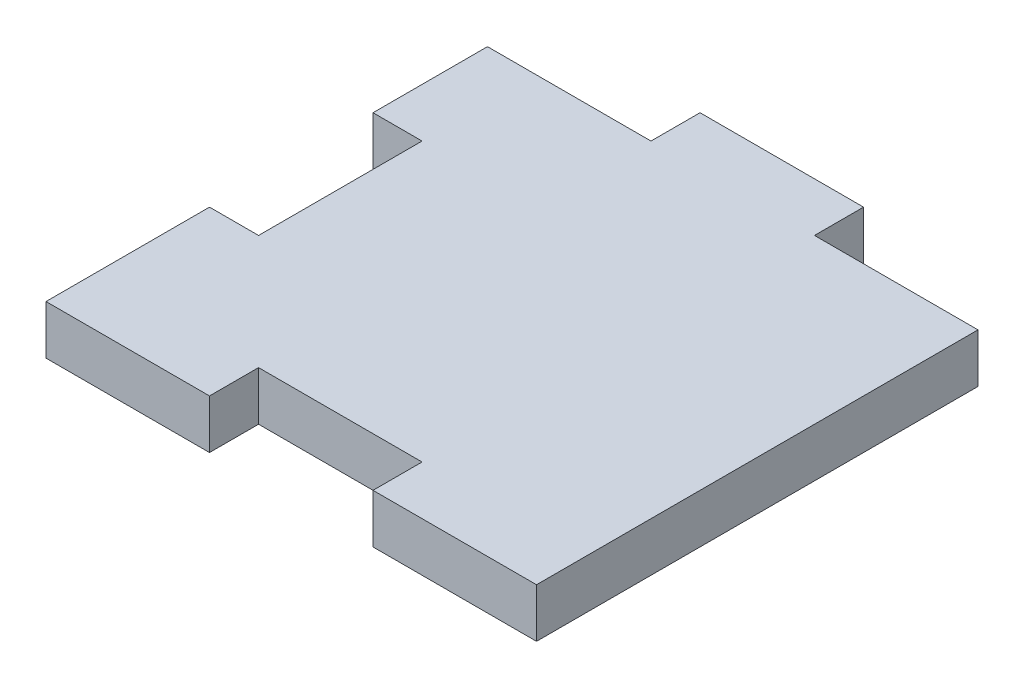
ISO-10303-21;
HEADER;
FILE_DESCRIPTION(('STEP AP214'),'2;1');
FILE_NAME('part.step','',(''),(''),'','','');
FILE_SCHEMA(('AUTOMOTIVE_DESIGN { 1 0 10303 214 1 1 1 1 }'));
ENDSEC;
DATA;
#1=APPLICATION_CONTEXT('core data for automotive mechanical design processes');
#2=APPLICATION_PROTOCOL_DEFINITION('international standard','automotive_design',2000,#1);
#3=PRODUCT_CONTEXT('',#1,'mechanical');
#4=PRODUCT('Part','Part','',(#3));
#5=PRODUCT_RELATED_PRODUCT_CATEGORY('part','',(#4));
#6=PRODUCT_DEFINITION_FORMATION('','',#4);
#7=PRODUCT_DEFINITION_CONTEXT('part definition',#1,'design');
#8=PRODUCT_DEFINITION('design','',#6,#7);
#9=PRODUCT_DEFINITION_SHAPE('','',#8);
#10=(LENGTH_UNIT() NAMED_UNIT(*) SI_UNIT(.MILLI.,.METRE.));
#11=(NAMED_UNIT(*) PLANE_ANGLE_UNIT() SI_UNIT($,.RADIAN.));
#12=(NAMED_UNIT(*) SI_UNIT($,.STERADIAN.) SOLID_ANGLE_UNIT());
#13=UNCERTAINTY_MEASURE_WITH_UNIT(LENGTH_MEASURE(1.E-05),#10,'distance_accuracy_value','');
#14=(GEOMETRIC_REPRESENTATION_CONTEXT(3) GLOBAL_UNCERTAINTY_ASSIGNED_CONTEXT((#13)) GLOBAL_UNIT_ASSIGNED_CONTEXT((#10,
#11,#12)) REPRESENTATION_CONTEXT('',''));
#15=CARTESIAN_POINT('',(0.,0.,0.));
#16=DIRECTION('',(0.,0.,1.));
#17=DIRECTION('',(1.,0.,0.));
#18=AXIS2_PLACEMENT_3D('',#15,#16,#17);
#19=CARTESIAN_POINT('',(-40.,10.,16.6666666666667));
#20=DIRECTION('',(0.,0.,1.));
#21=DIRECTION('',(1.,0.,0.));
#22=AXIS2_PLACEMENT_3D('',#19,#20,#21);
#23=PLANE('',#22);
#24=DIRECTION('',(-1.,0.,0.));
#25=VECTOR('',#24,1.);
#26=CARTESIAN_POINT('',(-40.,0.,16.6666666666667));
#27=LINE('',#26,#25);
#28=CARTESIAN_POINT('',(-40.,0.,16.6666666666667));
#29=VERTEX_POINT('',#28);
#30=CARTESIAN_POINT('',(-50.,0.,16.6666666666667));
#31=VERTEX_POINT('',#30);
#32=EDGE_CURVE('E183',#29,#31,#27,.T.);
#33=ORIENTED_EDGE('',*,*,#32,.T.);
#34=DIRECTION('',(0.,-1.,0.));
#35=VECTOR('',#34,1.);
#36=CARTESIAN_POINT('',(-50.,10.,16.6666666666667));
#37=LINE('',#36,#35);
#38=CARTESIAN_POINT('',(-50.,10.,16.6666666666667));
#39=VERTEX_POINT('',#38);
#40=EDGE_CURVE('E11',#39,#31,#37,.T.);
#41=ORIENTED_EDGE('',*,*,#40,.F.);
#42=DIRECTION('',(-1.,0.,0.));
#43=VECTOR('',#42,1.);
#44=CARTESIAN_POINT('',(-40.,10.,16.6666666666667));
#45=LINE('',#44,#43);
#46=CARTESIAN_POINT('',(-40.,10.,16.6666666666667));
#47=VERTEX_POINT('',#46);
#48=EDGE_CURVE('E213',#47,#39,#45,.T.);
#49=ORIENTED_EDGE('',*,*,#48,.F.);
#50=DIRECTION('',(0.,-1.,0.));
#51=VECTOR('',#50,1.);
#52=CARTESIAN_POINT('',(-40.,10.,16.6666666666667));
#53=LINE('',#52,#51);
#54=EDGE_CURVE('E179',#47,#29,#53,.T.);
#55=ORIENTED_EDGE('',*,*,#54,.T.);
#56=EDGE_LOOP('',(#33,#41,#49,#55));
#57=FACE_BOUND('',#56,.T.);
#58=ADVANCED_FACE('F39',(#57),#23,.F.);
#59=CARTESIAN_POINT('',(-50.,10.,16.6666666666667));
#60=DIRECTION('',(1.,0.,0.));
#61=DIRECTION('',(0.,0.,-1.));
#62=AXIS2_PLACEMENT_3D('',#59,#60,#61);
#63=PLANE('',#62);
#64=DIRECTION('',(0.,0.,1.));
#65=VECTOR('',#64,1.);
#66=CARTESIAN_POINT('',(-50.,0.,16.6666666666667));
#67=LINE('',#66,#65);
#68=CARTESIAN_POINT('',(-50.,0.,50.));
#69=VERTEX_POINT('',#68);
#70=EDGE_CURVE('E186',#31,#69,#67,.T.);
#71=ORIENTED_EDGE('',*,*,#70,.T.);
#72=DIRECTION('',(0.,-1.,0.));
#73=VECTOR('',#72,1.);
#74=CARTESIAN_POINT('',(-50.,10.,50.));
#75=LINE('',#74,#73);
#76=CARTESIAN_POINT('',(-50.,10.,50.));
#77=VERTEX_POINT('',#76);
#78=EDGE_CURVE('E47',#77,#69,#75,.T.);
#79=ORIENTED_EDGE('',*,*,#78,.F.);
#80=DIRECTION('',(0.,0.,1.));
#81=VECTOR('',#80,1.);
#82=CARTESIAN_POINT('',(-50.,10.,16.6666666666667));
#83=LINE('',#82,#81);
#84=EDGE_CURVE('E122',#39,#77,#83,.T.);
#85=ORIENTED_EDGE('',*,*,#84,.F.);
#86=ORIENTED_EDGE('',*,*,#40,.T.);
#87=EDGE_LOOP('',(#71,#79,#85,#86));
#88=FACE_BOUND('',#87,.T.);
#89=ADVANCED_FACE('F311',(#88),#63,.F.);
#90=CARTESIAN_POINT('',(-50.,10.,50.));
#91=DIRECTION('',(0.,0.,-1.));
#92=DIRECTION('',(-1.,0.,0.));
#93=AXIS2_PLACEMENT_3D('',#90,#91,#92);
#94=PLANE('',#93);
#95=DIRECTION('',(1.,0.,0.));
#96=VECTOR('',#95,1.);
#97=CARTESIAN_POINT('',(-50.,0.,50.));
#98=LINE('',#97,#96);
#99=CARTESIAN_POINT('',(-16.6666666666667,0.,50.));
#100=VERTEX_POINT('',#99);
#101=EDGE_CURVE('E188',#69,#100,#98,.T.);
#102=ORIENTED_EDGE('',*,*,#101,.T.);
#103=DIRECTION('',(0.,-1.,0.));
#104=VECTOR('',#103,1.);
#105=CARTESIAN_POINT('',(-16.6666666666667,10.,50.));
#106=LINE('',#105,#104);
#107=CARTESIAN_POINT('',(-16.6666666666667,10.,50.));
#108=VERTEX_POINT('',#107);
#109=EDGE_CURVE('E244',#108,#100,#106,.T.);
#110=ORIENTED_EDGE('',*,*,#109,.F.);
#111=DIRECTION('',(1.,0.,0.));
#112=VECTOR('',#111,1.);
#113=CARTESIAN_POINT('',(-50.,10.,50.));
#114=LINE('',#113,#112);
#115=EDGE_CURVE('E252',#77,#108,#114,.T.);
#116=ORIENTED_EDGE('',*,*,#115,.F.);
#117=ORIENTED_EDGE('',*,*,#78,.T.);
#118=EDGE_LOOP('',(#102,#110,#116,#117));
#119=FACE_BOUND('',#118,.T.);
#120=ADVANCED_FACE('F250',(#119),#94,.F.);
#121=CARTESIAN_POINT('',(-16.6666666666667,10.,50.));
#122=DIRECTION('',(-1.,0.,0.));
#123=DIRECTION('',(0.,0.,1.));
#124=AXIS2_PLACEMENT_3D('',#121,#122,#123);
#125=PLANE('',#124);
#126=DIRECTION('',(0.,0.,-1.));
#127=VECTOR('',#126,1.);
#128=CARTESIAN_POINT('',(-16.6666666666667,0.,50.));
#129=LINE('',#128,#127);
#130=CARTESIAN_POINT('',(-16.6666666666667,0.,40.));
#131=VERTEX_POINT('',#130);
#132=EDGE_CURVE('E190',#100,#131,#129,.T.);
#133=ORIENTED_EDGE('',*,*,#132,.T.);
#134=DIRECTION('',(0.,-1.,0.));
#135=VECTOR('',#134,1.);
#136=CARTESIAN_POINT('',(-16.6666666666667,10.,40.));
#137=LINE('',#136,#135);
#138=CARTESIAN_POINT('',(-16.6666666666667,10.,40.));
#139=VERTEX_POINT('',#138);
#140=EDGE_CURVE('E241',#139,#131,#137,.T.);
#141=ORIENTED_EDGE('',*,*,#140,.F.);
#142=DIRECTION('',(0.,0.,-1.));
#143=VECTOR('',#142,1.);
#144=CARTESIAN_POINT('',(-16.6666666666667,10.,50.));
#145=LINE('',#144,#143);
#146=EDGE_CURVE('E270',#108,#139,#145,.T.);
#147=ORIENTED_EDGE('',*,*,#146,.F.);
#148=ORIENTED_EDGE('',*,*,#109,.T.);
#149=EDGE_LOOP('',(#133,#141,#147,#148));
#150=FACE_BOUND('',#149,.T.);
#151=ADVANCED_FACE('F261',(#150),#125,.F.);
#152=CARTESIAN_POINT('',(-16.6666666666667,10.,40.));
#153=DIRECTION('',(0.,0.,-1.));
#154=DIRECTION('',(-1.,0.,0.));
#155=AXIS2_PLACEMENT_3D('',#152,#153,#154);
#156=PLANE('',#155);
#157=DIRECTION('',(1.,0.,0.));
#158=VECTOR('',#157,1.);
#159=CARTESIAN_POINT('',(-16.6666666666667,0.,40.));
#160=LINE('',#159,#158);
#161=CARTESIAN_POINT('',(16.6666666666667,0.,40.));
#162=VERTEX_POINT('',#161);
#163=EDGE_CURVE('E192',#131,#162,#160,.T.);
#164=ORIENTED_EDGE('',*,*,#163,.T.);
#165=DIRECTION('',(0.,-1.,0.));
#166=VECTOR('',#165,1.);
#167=CARTESIAN_POINT('',(16.6666666666667,10.,40.));
#168=LINE('',#167,#166);
#169=CARTESIAN_POINT('',(16.6666666666667,10.,40.));
#170=VERTEX_POINT('',#169);
#171=EDGE_CURVE('E238',#170,#162,#168,.T.);
#172=ORIENTED_EDGE('',*,*,#171,.F.);
#173=DIRECTION('',(1.,0.,0.));
#174=VECTOR('',#173,1.);
#175=CARTESIAN_POINT('',(-16.6666666666667,10.,40.));
#176=LINE('',#175,#174);
#177=EDGE_CURVE('E267',#139,#170,#176,.T.);
#178=ORIENTED_EDGE('',*,*,#177,.F.);
#179=ORIENTED_EDGE('',*,*,#140,.T.);
#180=EDGE_LOOP('',(#164,#172,#178,#179));
#181=FACE_BOUND('',#180,.T.);
#182=ADVANCED_FACE('F265',(#181),#156,.F.);
#183=CARTESIAN_POINT('',(16.6666666666667,10.,40.));
#184=DIRECTION('',(1.,0.,0.));
#185=DIRECTION('',(0.,0.,-1.));
#186=AXIS2_PLACEMENT_3D('',#183,#184,#185);
#187=PLANE('',#186);
#188=DIRECTION('',(0.,0.,1.));
#189=VECTOR('',#188,1.);
#190=CARTESIAN_POINT('',(16.6666666666667,0.,40.));
#191=LINE('',#190,#189);
#192=CARTESIAN_POINT('',(16.6666666666667,0.,50.));
#193=VERTEX_POINT('',#192);
#194=EDGE_CURVE('E194',#162,#193,#191,.T.);
#195=ORIENTED_EDGE('',*,*,#194,.T.);
#196=DIRECTION('',(0.,-1.,0.));
#197=VECTOR('',#196,1.);
#198=CARTESIAN_POINT('',(16.6666666666667,10.,50.));
#199=LINE('',#198,#197);
#200=CARTESIAN_POINT('',(16.6666666666667,10.,50.));
#201=VERTEX_POINT('',#200);
#202=EDGE_CURVE('E235',#201,#193,#199,.T.);
#203=ORIENTED_EDGE('',*,*,#202,.F.);
#204=DIRECTION('',(0.,0.,1.));
#205=VECTOR('',#204,1.);
#206=CARTESIAN_POINT('',(16.6666666666667,10.,40.));
#207=LINE('',#206,#205);
#208=EDGE_CURVE('E269',#170,#201,#207,.T.);
#209=ORIENTED_EDGE('',*,*,#208,.F.);
#210=ORIENTED_EDGE('',*,*,#171,.T.);
#211=EDGE_LOOP('',(#195,#203,#209,#210));
#212=FACE_BOUND('',#211,.T.);
#213=ADVANCED_FACE('F324',(#212),#187,.F.);
#214=CARTESIAN_POINT('',(16.6666666666667,10.,50.));
#215=DIRECTION('',(0.,0.,-1.));
#216=DIRECTION('',(-1.,0.,0.));
#217=AXIS2_PLACEMENT_3D('',#214,#215,#216);
#218=PLANE('',#217);
#219=DIRECTION('',(1.,0.,0.));
#220=VECTOR('',#219,1.);
#221=CARTESIAN_POINT('',(16.6666666666667,0.,50.));
#222=LINE('',#221,#220);
#223=CARTESIAN_POINT('',(50.,0.,50.));
#224=VERTEX_POINT('',#223);
#225=EDGE_CURVE('E196',#193,#224,#222,.T.);
#226=ORIENTED_EDGE('',*,*,#225,.T.);
#227=DIRECTION('',(0.,-1.,0.));
#228=VECTOR('',#227,1.);
#229=CARTESIAN_POINT('',(50.,10.,50.));
#230=LINE('',#229,#228);
#231=CARTESIAN_POINT('',(50.,10.,50.));
#232=VERTEX_POINT('',#231);
#233=EDGE_CURVE('E232',#232,#224,#230,.T.);
#234=ORIENTED_EDGE('',*,*,#233,.F.);
#235=DIRECTION('',(1.,0.,0.));
#236=VECTOR('',#235,1.);
#237=CARTESIAN_POINT('',(16.6666666666667,10.,50.));
#238=LINE('',#237,#236);
#239=EDGE_CURVE('E272',#201,#232,#238,.T.);
#240=ORIENTED_EDGE('',*,*,#239,.F.);
#241=ORIENTED_EDGE('',*,*,#202,.T.);
#242=EDGE_LOOP('',(#226,#234,#240,#241));
#243=FACE_BOUND('',#242,.T.);
#244=ADVANCED_FACE('F327',(#243),#218,.F.);
#245=CARTESIAN_POINT('',(50.,10.,50.));
#246=DIRECTION('',(-1.,0.,0.));
#247=DIRECTION('',(0.,0.,1.));
#248=AXIS2_PLACEMENT_3D('',#245,#246,#247);
#249=PLANE('',#248);
#250=DIRECTION('',(0.,0.,-1.));
#251=VECTOR('',#250,1.);
#252=CARTESIAN_POINT('',(50.,0.,50.));
#253=LINE('',#252,#251);
#254=CARTESIAN_POINT('',(50.,0.,-40.));
#255=VERTEX_POINT('',#254);
#256=EDGE_CURVE('E198',#224,#255,#253,.T.);
#257=ORIENTED_EDGE('',*,*,#256,.T.);
#258=DIRECTION('',(0.,-1.,0.));
#259=VECTOR('',#258,1.);
#260=CARTESIAN_POINT('',(50.,10.,-40.));
#261=LINE('',#260,#259);
#262=CARTESIAN_POINT('',(50.,10.,-40.));
#263=VERTEX_POINT('',#262);
#264=EDGE_CURVE('E229',#263,#255,#261,.T.);
#265=ORIENTED_EDGE('',*,*,#264,.F.);
#266=DIRECTION('',(0.,0.,-1.));
#267=VECTOR('',#266,1.);
#268=CARTESIAN_POINT('',(50.,10.,50.));
#269=LINE('',#268,#267);
#270=EDGE_CURVE('E278',#232,#263,#269,.T.);
#271=ORIENTED_EDGE('',*,*,#270,.F.);
#272=ORIENTED_EDGE('',*,*,#233,.T.);
#273=EDGE_LOOP('',(#257,#265,#271,#272));
#274=FACE_BOUND('',#273,.T.);
#275=ADVANCED_FACE('F331',(#274),#249,.F.);
#276=CARTESIAN_POINT('',(50.,10.,-40.));
#277=DIRECTION('',(0.,0.,1.));
#278=DIRECTION('',(1.,0.,0.));
#279=AXIS2_PLACEMENT_3D('',#276,#277,#278);
#280=PLANE('',#279);
#281=DIRECTION('',(-1.,0.,0.));
#282=VECTOR('',#281,1.);
#283=CARTESIAN_POINT('',(50.,0.,-40.));
#284=LINE('',#283,#282);
#285=CARTESIAN_POINT('',(16.6666666666667,0.,-40.));
#286=VERTEX_POINT('',#285);
#287=EDGE_CURVE('E200',#255,#286,#284,.T.);
#288=ORIENTED_EDGE('',*,*,#287,.T.);
#289=DIRECTION('',(0.,-1.,0.));
#290=VECTOR('',#289,1.);
#291=CARTESIAN_POINT('',(16.6666666666667,10.,-40.));
#292=LINE('',#291,#290);
#293=CARTESIAN_POINT('',(16.6666666666667,10.,-40.));
#294=VERTEX_POINT('',#293);
#295=EDGE_CURVE('E226',#294,#286,#292,.T.);
#296=ORIENTED_EDGE('',*,*,#295,.F.);
#297=DIRECTION('',(-1.,0.,0.));
#298=VECTOR('',#297,1.);
#299=CARTESIAN_POINT('',(50.,10.,-40.));
#300=LINE('',#299,#298);
#301=EDGE_CURVE('E280',#263,#294,#300,.T.);
#302=ORIENTED_EDGE('',*,*,#301,.F.);
#303=ORIENTED_EDGE('',*,*,#264,.T.);
#304=EDGE_LOOP('',(#288,#296,#302,#303));
#305=FACE_BOUND('',#304,.T.);
#306=ADVANCED_FACE('F335',(#305),#280,.F.);
#307=CARTESIAN_POINT('',(16.6666666666667,10.,-40.));
#308=DIRECTION('',(-1.,0.,0.));
#309=DIRECTION('',(0.,0.,1.));
#310=AXIS2_PLACEMENT_3D('',#307,#308,#309);
#311=PLANE('',#310);
#312=DIRECTION('',(0.,0.,-1.));
#313=VECTOR('',#312,1.);
#314=CARTESIAN_POINT('',(16.6666666666667,0.,-40.));
#315=LINE('',#314,#313);
#316=CARTESIAN_POINT('',(16.6666666666667,0.,-50.));
#317=VERTEX_POINT('',#316);
#318=EDGE_CURVE('E202',#286,#317,#315,.T.);
#319=ORIENTED_EDGE('',*,*,#318,.T.);
#320=DIRECTION('',(0.,-1.,0.));
#321=VECTOR('',#320,1.);
#322=CARTESIAN_POINT('',(16.6666666666667,10.,-50.));
#323=LINE('',#322,#321);
#324=CARTESIAN_POINT('',(16.6666666666667,10.,-50.));
#325=VERTEX_POINT('',#324);
#326=EDGE_CURVE('E223',#325,#317,#323,.T.);
#327=ORIENTED_EDGE('',*,*,#326,.F.);
#328=DIRECTION('',(0.,0.,-1.));
#329=VECTOR('',#328,1.);
#330=CARTESIAN_POINT('',(16.6666666666667,10.,-40.));
#331=LINE('',#330,#329);
#332=EDGE_CURVE('E282',#294,#325,#331,.T.);
#333=ORIENTED_EDGE('',*,*,#332,.F.);
#334=ORIENTED_EDGE('',*,*,#295,.T.);
#335=EDGE_LOOP('',(#319,#327,#333,#334));
#336=FACE_BOUND('',#335,.T.);
#337=ADVANCED_FACE('F339',(#336),#311,.F.);
#338=CARTESIAN_POINT('',(16.6666666666667,10.,-50.));
#339=DIRECTION('',(0.,0.,1.));
#340=DIRECTION('',(1.,0.,0.));
#341=AXIS2_PLACEMENT_3D('',#338,#339,#340);
#342=PLANE('',#341);
#343=DIRECTION('',(-1.,0.,0.));
#344=VECTOR('',#343,1.);
#345=CARTESIAN_POINT('',(16.6666666666667,0.,-50.));
#346=LINE('',#345,#344);
#347=CARTESIAN_POINT('',(-16.6666666666667,0.,-50.));
#348=VERTEX_POINT('',#347);
#349=EDGE_CURVE('E204',#317,#348,#346,.T.);
#350=ORIENTED_EDGE('',*,*,#349,.T.);
#351=DIRECTION('',(0.,-1.,0.));
#352=VECTOR('',#351,1.);
#353=CARTESIAN_POINT('',(-16.6666666666667,10.,-50.));
#354=LINE('',#353,#352);
#355=CARTESIAN_POINT('',(-16.6666666666667,10.,-50.));
#356=VERTEX_POINT('',#355);
#357=EDGE_CURVE('E220',#356,#348,#354,.T.);
#358=ORIENTED_EDGE('',*,*,#357,.F.);
#359=DIRECTION('',(-1.,0.,0.));
#360=VECTOR('',#359,1.);
#361=CARTESIAN_POINT('',(16.6666666666667,10.,-50.));
#362=LINE('',#361,#360);
#363=EDGE_CURVE('E284',#325,#356,#362,.T.);
#364=ORIENTED_EDGE('',*,*,#363,.F.);
#365=ORIENTED_EDGE('',*,*,#326,.T.);
#366=EDGE_LOOP('',(#350,#358,#364,#365));
#367=FACE_BOUND('',#366,.T.);
#368=ADVANCED_FACE('F343',(#367),#342,.F.);
#369=CARTESIAN_POINT('',(-16.6666666666667,10.,-50.));
#370=DIRECTION('',(1.,0.,0.));
#371=DIRECTION('',(0.,0.,-1.));
#372=AXIS2_PLACEMENT_3D('',#369,#370,#371);
#373=PLANE('',#372);
#374=DIRECTION('',(0.,0.,1.));
#375=VECTOR('',#374,1.);
#376=CARTESIAN_POINT('',(-16.6666666666667,0.,-50.));
#377=LINE('',#376,#375);
#378=CARTESIAN_POINT('',(-16.6666666666667,0.,-40.));
#379=VERTEX_POINT('',#378);
#380=EDGE_CURVE('E206',#348,#379,#377,.T.);
#381=ORIENTED_EDGE('',*,*,#380,.T.);
#382=DIRECTION('',(0.,-1.,0.));
#383=VECTOR('',#382,1.);
#384=CARTESIAN_POINT('',(-16.6666666666667,10.,-40.));
#385=LINE('',#384,#383);
#386=CARTESIAN_POINT('',(-16.6666666666667,10.,-40.));
#387=VERTEX_POINT('',#386);
#388=EDGE_CURVE('E217',#387,#379,#385,.T.);
#389=ORIENTED_EDGE('',*,*,#388,.F.);
#390=DIRECTION('',(0.,0.,1.));
#391=VECTOR('',#390,1.);
#392=CARTESIAN_POINT('',(-16.6666666666667,10.,-50.));
#393=LINE('',#392,#391);
#394=EDGE_CURVE('E286',#356,#387,#393,.T.);
#395=ORIENTED_EDGE('',*,*,#394,.F.);
#396=ORIENTED_EDGE('',*,*,#357,.T.);
#397=EDGE_LOOP('',(#381,#389,#395,#396));
#398=FACE_BOUND('',#397,.T.);
#399=ADVANCED_FACE('F292',(#398),#373,.F.);
#400=CARTESIAN_POINT('',(-16.6666666666667,10.,-40.));
#401=DIRECTION('',(0.,0.,1.));
#402=DIRECTION('',(1.,0.,0.));
#403=AXIS2_PLACEMENT_3D('',#400,#401,#402);
#404=PLANE('',#403);
#405=DIRECTION('',(-1.,0.,0.));
#406=VECTOR('',#405,1.);
#407=CARTESIAN_POINT('',(-16.6666666666667,0.,-40.));
#408=LINE('',#407,#406);
#409=CARTESIAN_POINT('',(-50.,0.,-40.));
#410=VERTEX_POINT('',#409);
#411=EDGE_CURVE('E208',#379,#410,#408,.T.);
#412=ORIENTED_EDGE('',*,*,#411,.T.);
#413=DIRECTION('',(0.,-1.,0.));
#414=VECTOR('',#413,1.);
#415=CARTESIAN_POINT('',(-50.,10.,-40.));
#416=LINE('',#415,#414);
#417=CARTESIAN_POINT('',(-50.,10.,-40.));
#418=VERTEX_POINT('',#417);
#419=EDGE_CURVE('E174',#418,#410,#416,.T.);
#420=ORIENTED_EDGE('',*,*,#419,.F.);
#421=DIRECTION('',(-1.,0.,0.));
#422=VECTOR('',#421,1.);
#423=CARTESIAN_POINT('',(-16.6666666666667,10.,-40.));
#424=LINE('',#423,#422);
#425=EDGE_CURVE('E165',#387,#418,#424,.T.);
#426=ORIENTED_EDGE('',*,*,#425,.F.);
#427=ORIENTED_EDGE('',*,*,#388,.T.);
#428=EDGE_LOOP('',(#412,#420,#426,#427));
#429=FACE_BOUND('',#428,.T.);
#430=ADVANCED_FACE('F296',(#429),#404,.F.);
#431=CARTESIAN_POINT('',(-50.,10.,-40.));
#432=DIRECTION('',(1.,0.,0.));
#433=DIRECTION('',(0.,0.,-1.));
#434=AXIS2_PLACEMENT_3D('',#431,#432,#433);
#435=PLANE('',#434);
#436=DIRECTION('',(0.,0.,1.));
#437=VECTOR('',#436,1.);
#438=CARTESIAN_POINT('',(-50.,0.,-40.));
#439=LINE('',#438,#437);
#440=CARTESIAN_POINT('',(-50.,0.,-16.6666666666667));
#441=VERTEX_POINT('',#440);
#442=EDGE_CURVE('E173',#410,#441,#439,.T.);
#443=ORIENTED_EDGE('',*,*,#442,.T.);
#444=DIRECTION('',(0.,-1.,0.));
#445=VECTOR('',#444,1.);
#446=CARTESIAN_POINT('',(-50.,10.,-16.6666666666667));
#447=LINE('',#446,#445);
#448=CARTESIAN_POINT('',(-50.,10.,-16.6666666666667));
#449=VERTEX_POINT('',#448);
#450=EDGE_CURVE('E170',#449,#441,#447,.T.);
#451=ORIENTED_EDGE('',*,*,#450,.F.);
#452=DIRECTION('',(0.,0.,1.));
#453=VECTOR('',#452,1.);
#454=CARTESIAN_POINT('',(-50.,10.,-40.));
#455=LINE('',#454,#453);
#456=EDGE_CURVE('E159',#418,#449,#455,.T.);
#457=ORIENTED_EDGE('',*,*,#456,.F.);
#458=ORIENTED_EDGE('',*,*,#419,.T.);
#459=EDGE_LOOP('',(#443,#451,#457,#458));
#460=FACE_BOUND('',#459,.T.);
#461=ADVANCED_FACE('F171',(#460),#435,.F.);
#462=CARTESIAN_POINT('',(-50.,10.,-16.6666666666667));
#463=DIRECTION('',(0.,0.,-1.));
#464=DIRECTION('',(-1.,0.,0.));
#465=AXIS2_PLACEMENT_3D('',#462,#463,#464);
#466=PLANE('',#465);
#467=DIRECTION('',(1.,0.,0.));
#468=VECTOR('',#467,1.);
#469=CARTESIAN_POINT('',(-50.,0.,-16.6666666666667));
#470=LINE('',#469,#468);
#471=CARTESIAN_POINT('',(-40.,0.,-16.6666666666667));
#472=VERTEX_POINT('',#471);
#473=EDGE_CURVE('E108',#441,#472,#470,.T.);
#474=ORIENTED_EDGE('',*,*,#473,.T.);
#475=DIRECTION('',(0.,-1.,0.));
#476=VECTOR('',#475,1.);
#477=CARTESIAN_POINT('',(-40.,10.,-16.6666666666667));
#478=LINE('',#477,#476);
#479=CARTESIAN_POINT('',(-40.,10.,-16.6666666666667));
#480=VERTEX_POINT('',#479);
#481=EDGE_CURVE('E175',#480,#472,#478,.T.);
#482=ORIENTED_EDGE('',*,*,#481,.F.);
#483=DIRECTION('',(1.,0.,0.));
#484=VECTOR('',#483,1.);
#485=CARTESIAN_POINT('',(-50.,10.,-16.6666666666667));
#486=LINE('',#485,#484);
#487=EDGE_CURVE('E163',#449,#480,#486,.T.);
#488=ORIENTED_EDGE('',*,*,#487,.F.);
#489=ORIENTED_EDGE('',*,*,#450,.T.);
#490=EDGE_LOOP('',(#474,#482,#488,#489));
#491=FACE_BOUND('',#490,.T.);
#492=ADVANCED_FACE('F177',(#491),#466,.F.);
#493=CARTESIAN_POINT('',(-40.,10.,-16.6666666666667));
#494=DIRECTION('',(1.,0.,0.));
#495=DIRECTION('',(0.,0.,-1.));
#496=AXIS2_PLACEMENT_3D('',#493,#494,#495);
#497=PLANE('',#496);
#498=DIRECTION('',(0.,0.,1.));
#499=VECTOR('',#498,1.);
#500=CARTESIAN_POINT('',(-40.,0.,-16.6666666666667));
#501=LINE('',#500,#499);
#502=EDGE_CURVE('E114',#472,#29,#501,.T.);
#503=ORIENTED_EDGE('',*,*,#502,.T.);
#504=ORIENTED_EDGE('',*,*,#54,.F.);
#505=DIRECTION('',(0.,0.,1.));
#506=VECTOR('',#505,1.);
#507=CARTESIAN_POINT('',(-40.,10.,-16.6666666666667));
#508=LINE('',#507,#506);
#509=EDGE_CURVE('E55',#480,#47,#508,.T.);
#510=ORIENTED_EDGE('',*,*,#509,.F.);
#511=ORIENTED_EDGE('',*,*,#481,.T.);
#512=EDGE_LOOP('',(#503,#504,#510,#511));
#513=FACE_BOUND('',#512,.T.);
#514=ADVANCED_FACE('F300',(#513),#497,.F.);
#515=CARTESIAN_POINT('',(0.,10.,0.));
#516=DIRECTION('',(0.,1.,0.));
#517=DIRECTION('',(0.,0.,1.));
#518=AXIS2_PLACEMENT_3D('',#515,#516,#517);
#519=PLANE('',#518);
#520=ORIENTED_EDGE('',*,*,#48,.T.);
#521=ORIENTED_EDGE('',*,*,#84,.T.);
#522=ORIENTED_EDGE('',*,*,#115,.T.);
#523=ORIENTED_EDGE('',*,*,#146,.T.);
#524=ORIENTED_EDGE('',*,*,#177,.T.);
#525=ORIENTED_EDGE('',*,*,#208,.T.);
#526=ORIENTED_EDGE('',*,*,#239,.T.);
#527=ORIENTED_EDGE('',*,*,#270,.T.);
#528=ORIENTED_EDGE('',*,*,#301,.T.);
#529=ORIENTED_EDGE('',*,*,#332,.T.);
#530=ORIENTED_EDGE('',*,*,#363,.T.);
#531=ORIENTED_EDGE('',*,*,#394,.T.);
#532=ORIENTED_EDGE('',*,*,#425,.T.);
#533=ORIENTED_EDGE('',*,*,#456,.T.);
#534=ORIENTED_EDGE('',*,*,#487,.T.);
#535=ORIENTED_EDGE('',*,*,#509,.T.);
#536=EDGE_LOOP('',(#520,#521,#522,#523,#524,#525,#526,#527,#528,#529,#530,#531,#532,#533,#534,#535));
#537=FACE_BOUND('',#536,.T.);
#538=ADVANCED_FACE('F161',(#537),#519,.T.);
#539=CARTESIAN_POINT('',(0.,0.,0.));
#540=DIRECTION('',(0.,1.,0.));
#541=DIRECTION('',(0.,0.,1.));
#542=AXIS2_PLACEMENT_3D('',#539,#540,#541);
#543=PLANE('',#542);
#544=ORIENTED_EDGE('',*,*,#32,.F.);
#545=ORIENTED_EDGE('',*,*,#502,.F.);
#546=ORIENTED_EDGE('',*,*,#473,.F.);
#547=ORIENTED_EDGE('',*,*,#442,.F.);
#548=ORIENTED_EDGE('',*,*,#411,.F.);
#549=ORIENTED_EDGE('',*,*,#380,.F.);
#550=ORIENTED_EDGE('',*,*,#349,.F.);
#551=ORIENTED_EDGE('',*,*,#318,.F.);
#552=ORIENTED_EDGE('',*,*,#287,.F.);
#553=ORIENTED_EDGE('',*,*,#256,.F.);
#554=ORIENTED_EDGE('',*,*,#225,.F.);
#555=ORIENTED_EDGE('',*,*,#194,.F.);
#556=ORIENTED_EDGE('',*,*,#163,.F.);
#557=ORIENTED_EDGE('',*,*,#132,.F.);
#558=ORIENTED_EDGE('',*,*,#101,.F.);
#559=ORIENTED_EDGE('',*,*,#70,.F.);
#560=EDGE_LOOP('',(#544,#545,#546,#547,#548,#549,#550,#551,#552,#553,#554,#555,#556,#557,#558,#559));
#561=FACE_BOUND('',#560,.T.);
#562=ADVANCED_FACE('F256',(#561),#543,.F.);
#563=CLOSED_SHELL('',(#58,#89,#120,#151,#182,#213,#244,#275,#306,#337,#368,#399,#430,#461,#492,
#514,#538,#562));
#564=MANIFOLD_SOLID_BREP('B2',#563);
#565=ADVANCED_BREP_SHAPE_REPRESENTATION('',(#18,#564),#14);
#566=SHAPE_DEFINITION_REPRESENTATION(#9,#565);
ENDSEC;
END-ISO-10303-21;
